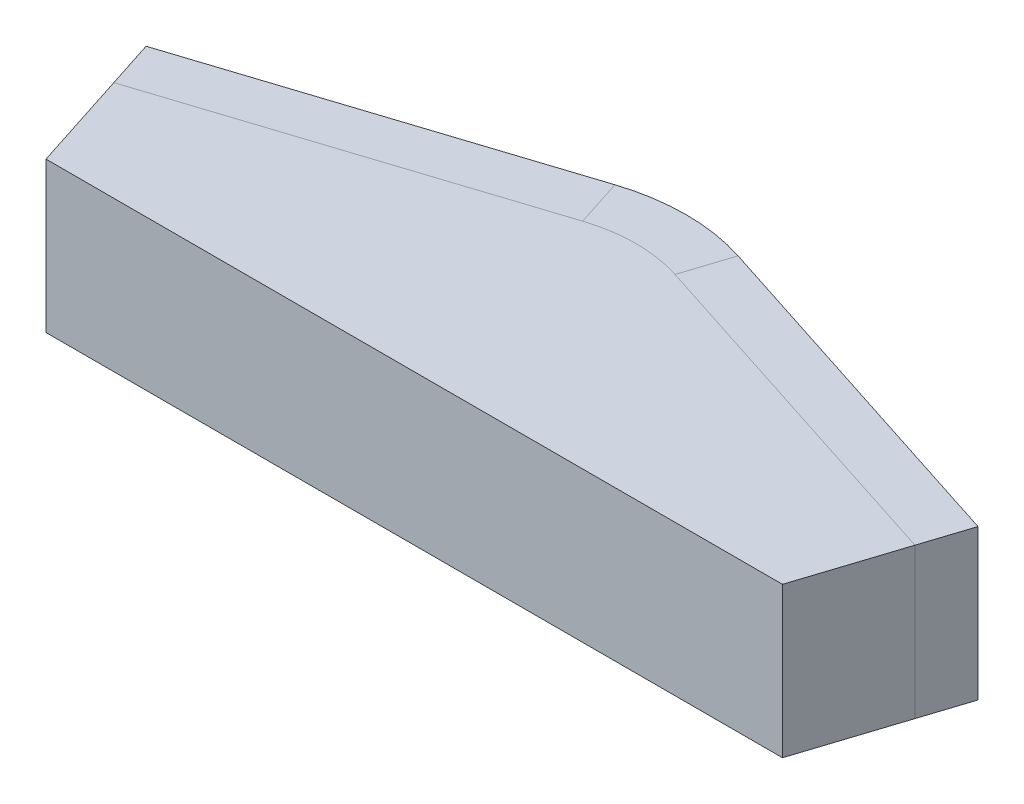
ISO-10303-21;
HEADER;
FILE_DESCRIPTION(('STEP AP214'),'2;1');
FILE_NAME('part.step','',(''),(''),'','','');
FILE_SCHEMA(('AUTOMOTIVE_DESIGN { 1 0 10303 214 1 1 1 1 }'));
ENDSEC;
DATA;
#1=APPLICATION_CONTEXT('core data for automotive mechanical design processes');
#2=APPLICATION_PROTOCOL_DEFINITION('international standard','automotive_design',2000,#1);
#3=PRODUCT_CONTEXT('',#1,'mechanical');
#4=PRODUCT('Part','Part','',(#3));
#5=PRODUCT_RELATED_PRODUCT_CATEGORY('part','',(#4));
#6=PRODUCT_DEFINITION_FORMATION('','',#4);
#7=PRODUCT_DEFINITION_CONTEXT('part definition',#1,'design');
#8=PRODUCT_DEFINITION('design','',#6,#7);
#9=PRODUCT_DEFINITION_SHAPE('','',#8);
#10=(LENGTH_UNIT() NAMED_UNIT(*) SI_UNIT(.MILLI.,.METRE.));
#11=(NAMED_UNIT(*) PLANE_ANGLE_UNIT() SI_UNIT($,.RADIAN.));
#12=(NAMED_UNIT(*) SI_UNIT($,.STERADIAN.) SOLID_ANGLE_UNIT());
#13=UNCERTAINTY_MEASURE_WITH_UNIT(LENGTH_MEASURE(1.E-05),#10,'distance_accuracy_value','');
#14=(GEOMETRIC_REPRESENTATION_CONTEXT(3) GLOBAL_UNCERTAINTY_ASSIGNED_CONTEXT((#13)) GLOBAL_UNIT_ASSIGNED_CONTEXT((#10,
#11,#12)) REPRESENTATION_CONTEXT('',''));
#15=CARTESIAN_POINT('',(0.,0.,0.));
#16=DIRECTION('',(0.,0.,1.));
#17=DIRECTION('',(1.,0.,0.));
#18=AXIS2_PLACEMENT_3D('',#15,#16,#17);
#19=CARTESIAN_POINT('',(25.4,-4.7625,8.20397646338431));
#20=DIRECTION('',(0.,1.,0.));
#21=DIRECTION('',(0.951594403879438,0.,0.307356617799808));
#22=AXIS2_PLACEMENT_3D('',#19,#20,#21);
#23=PLANE('',#22);
#24=DIRECTION('',(-0.307356617799808,0.,0.951594403879438));
#25=VECTOR('',#24,1.);
#26=CARTESIAN_POINT('',(2.92757178454318,-4.7625,0.945579921860638));
#27=LINE('',#26,#25);
#28=CARTESIAN_POINT('',(3.90342904605757,-4.7625,-2.07573231045658));
#29=VERTEX_POINT('',#28);
#30=CARTESIAN_POINT('',(2.92757178454318,-4.7625,0.945579921860638));
#31=VERTEX_POINT('',#30);
#32=EDGE_CURVE('E12',#29,#31,#27,.T.);
#33=ORIENTED_EDGE('',*,*,#32,.F.);
#34=DIRECTION('',(-0.951594403879438,0.,-0.307356617799808));
#35=VECTOR('',#34,1.);
#36=CARTESIAN_POINT('',(26.3758572615144,-4.7625,5.18266423106709));
#37=LINE('',#36,#35);
#38=CARTESIAN_POINT('',(26.3758572615144,-4.7625,5.18266423106709));
#39=VERTEX_POINT('',#38);
#40=EDGE_CURVE('E101',#29,#39,#37,.F.);
#41=ORIENTED_EDGE('',*,*,#40,.T.);
#42=DIRECTION('',(-0.307356617799808,0.,0.951594403879438));
#43=VECTOR('',#42,1.);
#44=CARTESIAN_POINT('',(25.4,-4.7625,8.20397646338431));
#45=LINE('',#44,#43);
#46=CARTESIAN_POINT('',(25.4,-4.7625,8.20397646338431));
#47=VERTEX_POINT('',#46);
#48=EDGE_CURVE('E61',#39,#47,#45,.T.);
#49=ORIENTED_EDGE('',*,*,#48,.T.);
#50=DIRECTION('',(0.951594403879438,0.,0.307356617799808));
#51=VECTOR('',#50,1.);
#52=CARTESIAN_POINT('',(25.4,-4.7625,8.20397646338431));
#53=LINE('',#52,#51);
#54=EDGE_CURVE('E104',#31,#47,#53,.T.);
#55=ORIENTED_EDGE('',*,*,#54,.F.);
#56=EDGE_LOOP('',(#33,#41,#49,#55));
#57=FACE_BOUND('',#56,.T.);
#58=ADVANCED_FACE('F51',(#57),#23,.F.);
#59=CARTESIAN_POINT('',(25.4,4.7625,8.20397646338431));
#60=DIRECTION('',(0.951594403879438,0.,0.307356617799808));
#61=DIRECTION('',(0.,-1.,0.));
#62=AXIS2_PLACEMENT_3D('',#59,#60,#61);
#63=PLANE('',#62);
#64=ORIENTED_EDGE('',*,*,#48,.F.);
#65=DIRECTION('',(0.,1.,0.));
#66=VECTOR('',#65,1.);
#67=CARTESIAN_POINT('',(26.3758572615144,4.7625,5.18266423106709));
#68=LINE('',#67,#66);
#69=CARTESIAN_POINT('',(26.3758572615144,4.7625,5.18266423106709));
#70=VERTEX_POINT('',#69);
#71=EDGE_CURVE('E129',#70,#39,#68,.F.);
#72=ORIENTED_EDGE('',*,*,#71,.F.);
#73=DIRECTION('',(-0.307356617799808,0.,0.951594403879438));
#74=VECTOR('',#73,1.);
#75=CARTESIAN_POINT('',(25.4,4.7625,8.20397646338431));
#76=LINE('',#75,#74);
#77=CARTESIAN_POINT('',(25.4,4.7625,8.20397646338431));
#78=VERTEX_POINT('',#77);
#79=EDGE_CURVE('E147',#70,#78,#76,.T.);
#80=ORIENTED_EDGE('',*,*,#79,.T.);
#81=DIRECTION('',(0.,-1.,0.));
#82=VECTOR('',#81,1.);
#83=CARTESIAN_POINT('',(25.4,4.7625,8.20397646338431));
#84=LINE('',#83,#82);
#85=EDGE_CURVE('E158',#78,#47,#84,.T.);
#86=ORIENTED_EDGE('',*,*,#85,.T.);
#87=EDGE_LOOP('',(#64,#72,#80,#86));
#88=FACE_BOUND('',#87,.T.);
#89=ADVANCED_FACE('F164',(#88),#63,.T.);
#90=CARTESIAN_POINT('',(25.4,4.7625,8.20397646338431));
#91=DIRECTION('',(0.,1.,0.));
#92=DIRECTION('',(0.951594403879438,0.,0.307356617799808));
#93=AXIS2_PLACEMENT_3D('',#90,#91,#92);
#94=PLANE('',#93);
#95=ORIENTED_EDGE('',*,*,#79,.F.);
#96=DIRECTION('',(-0.951594403879438,0.,-0.307356617799808));
#97=VECTOR('',#96,1.);
#98=CARTESIAN_POINT('',(26.3758572615144,4.7625,5.18266423106709));
#99=LINE('',#98,#97);
#100=CARTESIAN_POINT('',(3.90342904605757,4.7625,-2.07573231045658));
#101=VERTEX_POINT('',#100);
#102=EDGE_CURVE('E189',#101,#70,#99,.F.);
#103=ORIENTED_EDGE('',*,*,#102,.F.);
#104=DIRECTION('',(-0.307356617799809,0.,0.951594403879438));
#105=VECTOR('',#104,1.);
#106=CARTESIAN_POINT('',(2.92757178454318,4.7625,0.945579921860638));
#107=LINE('',#106,#105);
#108=CARTESIAN_POINT('',(2.92757178454318,4.7625,0.945579921860638));
#109=VERTEX_POINT('',#108);
#110=EDGE_CURVE('E144',#101,#109,#107,.T.);
#111=ORIENTED_EDGE('',*,*,#110,.T.);
#112=DIRECTION('',(0.951594403879438,0.,0.307356617799808));
#113=VECTOR('',#112,1.);
#114=CARTESIAN_POINT('',(25.4,4.7625,8.20397646338431));
#115=LINE('',#114,#113);
#116=EDGE_CURVE('E165',#109,#78,#115,.T.);
#117=ORIENTED_EDGE('',*,*,#116,.T.);
#118=EDGE_LOOP('',(#95,#103,#111,#117));
#119=FACE_BOUND('',#118,.T.);
#120=ADVANCED_FACE('F195',(#119),#94,.T.);
#121=CARTESIAN_POINT('',(0.,4.7625,10.0095166188123));
#122=DIRECTION('',(0.,1.,0.));
#123=DIRECTION('',(0.,0.,1.));
#124=AXIS2_PLACEMENT_3D('',#121,#122,#123);
#125=PLANE('',#124);
#126=ORIENTED_EDGE('',*,*,#110,.F.);
#127=CARTESIAN_POINT('',(0.,4.7625,10.0095166188123));
#128=DIRECTION('',(0.,1.,0.));
#129=DIRECTION('',(0.,0.,1.));
#130=AXIS2_PLACEMENT_3D('',#127,#128,#129);
#131=CIRCLE('',#130,12.7);
#132=CARTESIAN_POINT('',(-3.90342904605756,4.7625,-2.07573231045658));
#133=VERTEX_POINT('',#132);
#134=EDGE_CURVE('E119',#101,#133,#131,.T.);
#135=ORIENTED_EDGE('',*,*,#134,.T.);
#136=DIRECTION('',(0.307356617799808,0.,0.951594403879438));
#137=VECTOR('',#136,1.);
#138=CARTESIAN_POINT('',(-2.92757178454318,4.7625,0.945579921860638));
#139=LINE('',#138,#137);
#140=CARTESIAN_POINT('',(-2.92757178454318,4.7625,0.945579921860638));
#141=VERTEX_POINT('',#140);
#142=EDGE_CURVE('E69',#133,#141,#139,.T.);
#143=ORIENTED_EDGE('',*,*,#142,.T.);
#144=CARTESIAN_POINT('',(0.,4.7625,10.0095166188123));
#145=DIRECTION('',(0.,-1.,0.));
#146=DIRECTION('',(0.,0.,-1.));
#147=AXIS2_PLACEMENT_3D('',#144,#145,#146);
#148=CIRCLE('',#147,9.525);
#149=EDGE_CURVE('E162',#109,#141,#148,.F.);
#150=ORIENTED_EDGE('',*,*,#149,.F.);
#151=EDGE_LOOP('',(#126,#135,#143,#150));
#152=FACE_BOUND('',#151,.T.);
#153=ADVANCED_FACE('F198',(#152),#125,.T.);
#154=CARTESIAN_POINT('',(0.,4.7625,0.));
#155=DIRECTION('',(0.,1.,0.));
#156=DIRECTION('',(0.951594403879438,0.,-0.307356617799808));
#157=AXIS2_PLACEMENT_3D('',#154,#155,#156);
#158=PLANE('',#157);
#159=ORIENTED_EDGE('',*,*,#142,.F.);
#160=DIRECTION('',(-0.951594403879438,0.,0.307356617799808));
#161=VECTOR('',#160,1.);
#162=CARTESIAN_POINT('',(-0.975857261514391,4.7625,-3.02131223231722));
#163=LINE('',#162,#161);
#164=CARTESIAN_POINT('',(-26.3758572615144,4.7625,5.18266423106709));
#165=VERTEX_POINT('',#164);
#166=EDGE_CURVE('E188',#165,#133,#163,.F.);
#167=ORIENTED_EDGE('',*,*,#166,.F.);
#168=DIRECTION('',(0.307356617799808,0.,0.951594403879438));
#169=VECTOR('',#168,1.);
#170=CARTESIAN_POINT('',(-25.4,4.7625,8.20397646338431));
#171=LINE('',#170,#169);
#172=CARTESIAN_POINT('',(-25.4,4.7625,8.20397646338431));
#173=VERTEX_POINT('',#172);
#174=EDGE_CURVE('E140',#165,#173,#171,.T.);
#175=ORIENTED_EDGE('',*,*,#174,.T.);
#176=DIRECTION('',(0.951594403879438,0.,-0.307356617799808));
#177=VECTOR('',#176,1.);
#178=CARTESIAN_POINT('',(0.,4.7625,0.));
#179=LINE('',#178,#177);
#180=EDGE_CURVE('E172',#173,#141,#179,.T.);
#181=ORIENTED_EDGE('',*,*,#180,.T.);
#182=EDGE_LOOP('',(#159,#167,#175,#181));
#183=FACE_BOUND('',#182,.T.);
#184=ADVANCED_FACE('F209',(#183),#158,.T.);
#185=CARTESIAN_POINT('',(-25.4,4.7625,8.20397646338431));
#186=DIRECTION('',(0.951594403879438,0.,-0.307356617799808));
#187=DIRECTION('',(0.,-1.,0.));
#188=AXIS2_PLACEMENT_3D('',#185,#186,#187);
#189=PLANE('',#188);
#190=ORIENTED_EDGE('',*,*,#174,.F.);
#191=DIRECTION('',(0.,1.,0.));
#192=VECTOR('',#191,1.);
#193=CARTESIAN_POINT('',(-26.3758572615144,4.7625,5.18266423106709));
#194=LINE('',#193,#192);
#195=CARTESIAN_POINT('',(-26.3758572615144,-4.7625,5.18266423106709));
#196=VERTEX_POINT('',#195);
#197=EDGE_CURVE('E124',#165,#196,#194,.F.);
#198=ORIENTED_EDGE('',*,*,#197,.T.);
#199=DIRECTION('',(0.307356617799808,0.,0.951594403879438));
#200=VECTOR('',#199,1.);
#201=CARTESIAN_POINT('',(-25.4,-4.7625,8.20397646338431));
#202=LINE('',#201,#200);
#203=CARTESIAN_POINT('',(-25.4,-4.7625,8.20397646338431));
#204=VERTEX_POINT('',#203);
#205=EDGE_CURVE('E137',#196,#204,#202,.T.);
#206=ORIENTED_EDGE('',*,*,#205,.T.);
#207=DIRECTION('',(0.,-1.,0.));
#208=VECTOR('',#207,1.);
#209=CARTESIAN_POINT('',(-25.4,4.7625,8.20397646338431));
#210=LINE('',#209,#208);
#211=EDGE_CURVE('E175',#173,#204,#210,.T.);
#212=ORIENTED_EDGE('',*,*,#211,.F.);
#213=EDGE_LOOP('',(#190,#198,#206,#212));
#214=FACE_BOUND('',#213,.T.);
#215=ADVANCED_FACE('F215',(#214),#189,.F.);
#216=CARTESIAN_POINT('',(0.,-4.7625,0.));
#217=DIRECTION('',(0.,1.,0.));
#218=DIRECTION('',(0.951594403879438,0.,-0.307356617799808));
#219=AXIS2_PLACEMENT_3D('',#216,#217,#218);
#220=PLANE('',#219);
#221=ORIENTED_EDGE('',*,*,#205,.F.);
#222=DIRECTION('',(-0.951594403879438,0.,0.307356617799808));
#223=VECTOR('',#222,1.);
#224=CARTESIAN_POINT('',(-0.975857261514391,-4.7625,-3.02131223231722));
#225=LINE('',#224,#223);
#226=CARTESIAN_POINT('',(-3.90342904605757,-4.7625,-2.07573231045658));
#227=VERTEX_POINT('',#226);
#228=EDGE_CURVE('E186',#196,#227,#225,.F.);
#229=ORIENTED_EDGE('',*,*,#228,.T.);
#230=DIRECTION('',(0.307356617799808,0.,0.951594403879438));
#231=VECTOR('',#230,1.);
#232=CARTESIAN_POINT('',(-2.92757178454318,-4.7625,0.945579921860638));
#233=LINE('',#232,#231);
#234=CARTESIAN_POINT('',(-2.92757178454318,-4.7625,0.945579921860638));
#235=VERTEX_POINT('',#234);
#236=EDGE_CURVE('E55',#227,#235,#233,.T.);
#237=ORIENTED_EDGE('',*,*,#236,.T.);
#238=DIRECTION('',(0.951594403879438,0.,-0.307356617799808));
#239=VECTOR('',#238,1.);
#240=CARTESIAN_POINT('',(0.,-4.7625,0.));
#241=LINE('',#240,#239);
#242=EDGE_CURVE('E167',#204,#235,#241,.T.);
#243=ORIENTED_EDGE('',*,*,#242,.F.);
#244=EDGE_LOOP('',(#221,#229,#237,#243));
#245=FACE_BOUND('',#244,.T.);
#246=ADVANCED_FACE('F219',(#245),#220,.F.);
#247=CARTESIAN_POINT('',(0.,-4.7625,10.0095166188123));
#248=DIRECTION('',(0.,-1.,0.));
#249=DIRECTION('',(0.,0.,-1.));
#250=AXIS2_PLACEMENT_3D('',#247,#248,#249);
#251=PLANE('',#250);
#252=CARTESIAN_POINT('',(0.,-4.7625,10.0095166188123));
#253=DIRECTION('',(0.,1.,0.));
#254=DIRECTION('',(0.,0.,1.));
#255=AXIS2_PLACEMENT_3D('',#252,#253,#254);
#256=CIRCLE('',#255,12.7);
#257=EDGE_CURVE('E117',#227,#29,#256,.F.);
#258=ORIENTED_EDGE('',*,*,#257,.T.);
#259=ORIENTED_EDGE('',*,*,#32,.T.);
#260=CARTESIAN_POINT('',(0.,-4.7625,10.0095166188123));
#261=DIRECTION('',(0.,1.,0.));
#262=DIRECTION('',(0.,0.,1.));
#263=AXIS2_PLACEMENT_3D('',#260,#261,#262);
#264=CIRCLE('',#263,9.525);
#265=EDGE_CURVE('E182',#235,#31,#264,.F.);
#266=ORIENTED_EDGE('',*,*,#265,.F.);
#267=ORIENTED_EDGE('',*,*,#236,.F.);
#268=EDGE_LOOP('',(#258,#259,#266,#267));
#269=FACE_BOUND('',#268,.T.);
#270=ADVANCED_FACE('F53',(#269),#251,.T.);
#271=CARTESIAN_POINT('',(0.,4.7625,0.));
#272=DIRECTION('',(-0.307356617799808,0.,-0.951594403879438));
#273=DIRECTION('',(-0.951594403879438,0.,0.307356617799808));
#274=AXIS2_PLACEMENT_3D('',#271,#272,#273);
#275=PLANE('',#274);
#276=ORIENTED_EDGE('',*,*,#242,.T.);
#277=DIRECTION('',(0.,-1.,0.));
#278=VECTOR('',#277,1.);
#279=CARTESIAN_POINT('',(-2.92757178454318,4.7625,0.945579921860635));
#280=LINE('',#279,#278);
#281=EDGE_CURVE('E179',#235,#141,#280,.F.);
#282=ORIENTED_EDGE('',*,*,#281,.T.);
#283=ORIENTED_EDGE('',*,*,#180,.F.);
#284=ORIENTED_EDGE('',*,*,#211,.T.);
#285=EDGE_LOOP('',(#276,#282,#283,#284));
#286=FACE_BOUND('',#285,.T.);
#287=ADVANCED_FACE('F214',(#286),#275,.F.);
#288=CARTESIAN_POINT('',(25.4,4.7625,8.20397646338431));
#289=DIRECTION('',(0.307356617799808,0.,-0.951594403879438));
#290=DIRECTION('',(-0.951594403879438,0.,-0.307356617799808));
#291=AXIS2_PLACEMENT_3D('',#288,#289,#290);
#292=PLANE('',#291);
#293=ORIENTED_EDGE('',*,*,#116,.F.);
#294=DIRECTION('',(0.,-1.,0.));
#295=VECTOR('',#294,1.);
#296=CARTESIAN_POINT('',(2.92757178454317,-4.7625,0.945579921860633));
#297=LINE('',#296,#295);
#298=EDGE_CURVE('E161',#109,#31,#297,.T.);
#299=ORIENTED_EDGE('',*,*,#298,.T.);
#300=ORIENTED_EDGE('',*,*,#54,.T.);
#301=ORIENTED_EDGE('',*,*,#85,.F.);
#302=EDGE_LOOP('',(#293,#299,#300,#301));
#303=FACE_BOUND('',#302,.T.);
#304=ADVANCED_FACE('F157',(#303),#292,.F.);
#305=CARTESIAN_POINT('',(0.,4.7625,10.0095166188123));
#306=DIRECTION('',(0.,1.,0.));
#307=DIRECTION('',(0.,0.,1.));
#308=AXIS2_PLACEMENT_3D('',#305,#306,#307);
#309=CYLINDRICAL_SURFACE('',#308,9.525);
#310=ORIENTED_EDGE('',*,*,#149,.T.);
#311=ORIENTED_EDGE('',*,*,#281,.F.);
#312=ORIENTED_EDGE('',*,*,#265,.T.);
#313=ORIENTED_EDGE('',*,*,#298,.F.);
#314=EDGE_LOOP('',(#310,#311,#312,#313));
#315=FACE_BOUND('',#314,.T.);
#316=ADVANCED_FACE('F201',(#315),#309,.F.);
#317=CARTESIAN_POINT('',(-0.975857261514391,4.7625,-3.02131223231722));
#318=DIRECTION('',(-0.307356617799808,0.,-0.951594403879438));
#319=DIRECTION('',(-0.951594403879438,0.,0.307356617799808));
#320=AXIS2_PLACEMENT_3D('',#317,#318,#319);
#321=PLANE('',#320);
#322=ORIENTED_EDGE('',*,*,#228,.F.);
#323=ORIENTED_EDGE('',*,*,#197,.F.);
#324=ORIENTED_EDGE('',*,*,#166,.T.);
#325=DIRECTION('',(0.,1.,0.));
#326=VECTOR('',#325,1.);
#327=CARTESIAN_POINT('',(-3.90342904605757,4.7625,-2.07573231045658));
#328=LINE('',#327,#326);
#329=EDGE_CURVE('E123',#227,#133,#328,.T.);
#330=ORIENTED_EDGE('',*,*,#329,.F.);
#331=EDGE_LOOP('',(#322,#323,#324,#330));
#332=FACE_BOUND('',#331,.T.);
#333=ADVANCED_FACE('F221',(#332),#321,.T.);
#334=CARTESIAN_POINT('',(26.3758572615144,4.7625,5.18266423106709));
#335=DIRECTION('',(0.307356617799808,0.,-0.951594403879438));
#336=DIRECTION('',(-0.951594403879438,0.,-0.307356617799808));
#337=AXIS2_PLACEMENT_3D('',#334,#335,#336);
#338=PLANE('',#337);
#339=ORIENTED_EDGE('',*,*,#102,.T.);
#340=ORIENTED_EDGE('',*,*,#71,.T.);
#341=ORIENTED_EDGE('',*,*,#40,.F.);
#342=DIRECTION('',(0.,1.,0.));
#343=VECTOR('',#342,1.);
#344=CARTESIAN_POINT('',(3.90342904605757,4.7625,-2.07573231045658));
#345=LINE('',#344,#343);
#346=EDGE_CURVE('E114',#101,#29,#345,.F.);
#347=ORIENTED_EDGE('',*,*,#346,.F.);
#348=EDGE_LOOP('',(#339,#340,#341,#347));
#349=FACE_BOUND('',#348,.T.);
#350=ADVANCED_FACE('F127',(#349),#338,.T.);
#351=CARTESIAN_POINT('',(0.,4.7625,10.0095166188123));
#352=DIRECTION('',(0.,1.,0.));
#353=DIRECTION('',(0.,0.,1.));
#354=AXIS2_PLACEMENT_3D('',#351,#352,#353);
#355=CYLINDRICAL_SURFACE('',#354,12.7);
#356=ORIENTED_EDGE('',*,*,#134,.F.);
#357=ORIENTED_EDGE('',*,*,#346,.T.);
#358=ORIENTED_EDGE('',*,*,#257,.F.);
#359=ORIENTED_EDGE('',*,*,#329,.T.);
#360=EDGE_LOOP('',(#356,#357,#358,#359));
#361=FACE_BOUND('',#360,.T.);
#362=ADVANCED_FACE('F115',(#361),#355,.T.);
#363=CLOSED_SHELL('',(#58,#89,#120,#153,#184,#215,#246,#270,#287,#304,#316,#333,#350,#362));
#364=MANIFOLD_SOLID_BREP('B2',#363);
#365=CARTESIAN_POINT('',(0.,-4.7625,0.));
#366=DIRECTION('',(0.,-1.,0.));
#367=DIRECTION('',(0.,0.,-1.));
#368=AXIS2_PLACEMENT_3D('',#365,#366,#367);
#369=PLANE('',#368);
#370=DIRECTION('',(0.307356617799808,0.,0.951594403879438));
#371=VECTOR('',#370,1.);
#372=CARTESIAN_POINT('',(-23.3490058841539,-4.7625,14.5539764633843));
#373=LINE('',#372,#371);
#374=CARTESIAN_POINT('',(-25.4,-4.7625,8.20397646338431));
#375=VERTEX_POINT('',#374);
#376=CARTESIAN_POINT('',(-23.3490058841539,-4.7625,14.5539764633843));
#377=VERTEX_POINT('',#376);
#378=EDGE_CURVE('E389',#375,#377,#373,.T.);
#379=ORIENTED_EDGE('',*,*,#378,.F.);
#380=DIRECTION('',(-0.951594403879438,0.,0.307356617799808));
#381=VECTOR('',#380,1.);
#382=CARTESIAN_POINT('',(-25.4,-4.7625,8.20397646338431));
#383=LINE('',#382,#381);
#384=CARTESIAN_POINT('',(-2.92757178454321,-4.7625,0.945579921860649));
#385=VERTEX_POINT('',#384);
#386=EDGE_CURVE('E463',#385,#375,#383,.T.);
#387=ORIENTED_EDGE('',*,*,#386,.F.);
#388=CARTESIAN_POINT('',(0.,-4.7625,10.0095166188123));
#389=DIRECTION('',(0.,-1.,0.));
#390=DIRECTION('',(0.,0.,-1.));
#391=AXIS2_PLACEMENT_3D('',#388,#389,#390);
#392=CIRCLE('',#391,9.525);
#393=CARTESIAN_POINT('',(2.92757178454321,-4.7625,0.945579921860649));
#394=VERTEX_POINT('',#393);
#395=EDGE_CURVE('E467',#394,#385,#392,.F.);
#396=ORIENTED_EDGE('',*,*,#395,.F.);
#397=DIRECTION('',(-0.951594403879438,0.,-0.307356617799808));
#398=VECTOR('',#397,1.);
#399=CARTESIAN_POINT('',(2.92757178454321,-4.7625,0.945579921860649));
#400=LINE('',#399,#398);
#401=CARTESIAN_POINT('',(25.4,-4.7625,8.20397646338431));
#402=VERTEX_POINT('',#401);
#403=EDGE_CURVE('E418',#402,#394,#400,.T.);
#404=ORIENTED_EDGE('',*,*,#403,.F.);
#405=DIRECTION('',(0.307356617799808,0.,-0.951594403879438));
#406=VECTOR('',#405,1.);
#407=CARTESIAN_POINT('',(25.4,-4.7625,8.20397646338431));
#408=LINE('',#407,#406);
#409=CARTESIAN_POINT('',(23.3490058841539,-4.76250000000002,14.5539764633843));
#410=VERTEX_POINT('',#409);
#411=EDGE_CURVE('E423',#410,#402,#408,.T.);
#412=ORIENTED_EDGE('',*,*,#411,.F.);
#413=DIRECTION('',(1.,0.,0.));
#414=VECTOR('',#413,1.);
#415=CARTESIAN_POINT('',(23.3490058841539,-4.7625,14.5539764633843));
#416=LINE('',#415,#414);
#417=EDGE_CURVE('E444',#377,#410,#416,.T.);
#418=ORIENTED_EDGE('',*,*,#417,.F.);
#419=EDGE_LOOP('',(#379,#387,#396,#404,#412,#418));
#420=FACE_BOUND('',#419,.T.);
#421=ADVANCED_FACE('F381',(#420),#369,.T.);
#422=CARTESIAN_POINT('',(0.,4.7625,10.0095166188123));
#423=DIRECTION('',(0.,1.,0.));
#424=DIRECTION('',(0.,0.,1.));
#425=AXIS2_PLACEMENT_3D('',#422,#423,#424);
#426=PLANE('',#425);
#427=DIRECTION('',(0.307356617799808,0.,0.951594403879438));
#428=VECTOR('',#427,1.);
#429=CARTESIAN_POINT('',(-23.3490058841539,4.7625,14.5539764633843));
#430=LINE('',#429,#428);
#431=CARTESIAN_POINT('',(-25.4,4.7625,8.20397646338431));
#432=VERTEX_POINT('',#431);
#433=CARTESIAN_POINT('',(-23.3490058841539,4.7625,14.5539764633843));
#434=VERTEX_POINT('',#433);
#435=EDGE_CURVE('E454',#432,#434,#430,.T.);
#436=ORIENTED_EDGE('',*,*,#435,.T.);
#437=DIRECTION('',(1.,0.,0.));
#438=VECTOR('',#437,1.);
#439=CARTESIAN_POINT('',(23.3490058841539,4.7625,14.5539764633843));
#440=LINE('',#439,#438);
#441=CARTESIAN_POINT('',(23.3490058841539,4.7625,14.5539764633843));
#442=VERTEX_POINT('',#441);
#443=EDGE_CURVE('E442',#434,#442,#440,.T.);
#444=ORIENTED_EDGE('',*,*,#443,.T.);
#445=DIRECTION('',(0.307356617799808,0.,-0.951594403879438));
#446=VECTOR('',#445,1.);
#447=CARTESIAN_POINT('',(25.4,4.7625,8.20397646338431));
#448=LINE('',#447,#446);
#449=CARTESIAN_POINT('',(25.4,4.7625,8.20397646338431));
#450=VERTEX_POINT('',#449);
#451=EDGE_CURVE('E446',#442,#450,#448,.T.);
#452=ORIENTED_EDGE('',*,*,#451,.T.);
#453=DIRECTION('',(-0.951594403879438,0.,-0.307356617799808));
#454=VECTOR('',#453,1.);
#455=CARTESIAN_POINT('',(2.92757178454321,4.7625,0.945579921860649));
#456=LINE('',#455,#454);
#457=CARTESIAN_POINT('',(2.92757178454321,4.7625,0.945579921860651));
#458=VERTEX_POINT('',#457);
#459=EDGE_CURVE('E450',#450,#458,#456,.T.);
#460=ORIENTED_EDGE('',*,*,#459,.T.);
#461=CARTESIAN_POINT('',(0.,4.7625,10.0095166188123));
#462=DIRECTION('',(0.,1.,0.));
#463=DIRECTION('',(0.,0.,1.));
#464=AXIS2_PLACEMENT_3D('',#461,#462,#463);
#465=CIRCLE('',#464,9.525);
#466=CARTESIAN_POINT('',(-2.92757178454321,4.7625,0.945579921860649));
#467=VERTEX_POINT('',#466);
#468=EDGE_CURVE('E482',#458,#467,#465,.T.);
#469=ORIENTED_EDGE('',*,*,#468,.T.);
#470=DIRECTION('',(-0.951594403879438,0.,0.307356617799808));
#471=VECTOR('',#470,1.);
#472=CARTESIAN_POINT('',(-25.4,4.7625,8.20397646338431));
#473=LINE('',#472,#471);
#474=EDGE_CURVE('E460',#467,#432,#473,.T.);
#475=ORIENTED_EDGE('',*,*,#474,.T.);
#476=EDGE_LOOP('',(#436,#444,#452,#460,#469,#475));
#477=FACE_BOUND('',#476,.T.);
#478=ADVANCED_FACE('F452',(#477),#426,.T.);
#479=CARTESIAN_POINT('',(23.3490058841539,-57.4748296802373,14.5539764633843));
#480=DIRECTION('',(0.,0.,1.));
#481=DIRECTION('',(1.,0.,0.));
#482=AXIS2_PLACEMENT_3D('',#479,#480,#481);
#483=PLANE('',#482);
#484=DIRECTION('',(0.,1.,0.));
#485=VECTOR('',#484,1.);
#486=CARTESIAN_POINT('',(-23.3490058841539,-57.4748296802373,14.5539764633843));
#487=LINE('',#486,#485);
#488=EDGE_CURVE('E49',#377,#434,#487,.T.);
#489=ORIENTED_EDGE('',*,*,#488,.F.);
#490=ORIENTED_EDGE('',*,*,#417,.T.);
#491=DIRECTION('',(0.,1.,0.));
#492=VECTOR('',#491,1.);
#493=CARTESIAN_POINT('',(23.3490058841539,-57.4748296802373,14.5539764633843));
#494=LINE('',#493,#492);
#495=EDGE_CURVE('E439',#410,#442,#494,.T.);
#496=ORIENTED_EDGE('',*,*,#495,.T.);
#497=ORIENTED_EDGE('',*,*,#443,.F.);
#498=EDGE_LOOP('',(#489,#490,#496,#497));
#499=FACE_BOUND('',#498,.T.);
#500=ADVANCED_FACE('F440',(#499),#483,.T.);
#501=CARTESIAN_POINT('',(25.4,-57.4748296802373,8.20397646338431));
#502=DIRECTION('',(0.951594403879438,0.,0.307356617799808));
#503=DIRECTION('',(0.307356617799808,0.,-0.951594403879438));
#504=AXIS2_PLACEMENT_3D('',#501,#502,#503);
#505=PLANE('',#504);
#506=ORIENTED_EDGE('',*,*,#495,.F.);
#507=ORIENTED_EDGE('',*,*,#411,.T.);
#508=DIRECTION('',(0.,1.,0.));
#509=VECTOR('',#508,1.);
#510=CARTESIAN_POINT('',(25.4,-57.4748296802373,8.20397646338431));
#511=LINE('',#510,#509);
#512=EDGE_CURVE('E434',#402,#450,#511,.T.);
#513=ORIENTED_EDGE('',*,*,#512,.T.);
#514=ORIENTED_EDGE('',*,*,#451,.F.);
#515=EDGE_LOOP('',(#506,#507,#513,#514));
#516=FACE_BOUND('',#515,.T.);
#517=ADVANCED_FACE('F447',(#516),#505,.T.);
#518=CARTESIAN_POINT('',(2.92757178454321,-57.4748296802373,0.945579921860649));
#519=DIRECTION('',(0.307356617799808,0.,-0.951594403879438));
#520=DIRECTION('',(-0.951594403879438,0.,-0.307356617799808));
#521=AXIS2_PLACEMENT_3D('',#518,#519,#520);
#522=PLANE('',#521);
#523=ORIENTED_EDGE('',*,*,#512,.F.);
#524=ORIENTED_EDGE('',*,*,#403,.T.);
#525=DIRECTION('',(0.,1.,0.));
#526=VECTOR('',#525,1.);
#527=CARTESIAN_POINT('',(2.92757178454321,-57.4748296802373,0.945579921860651));
#528=LINE('',#527,#526);
#529=EDGE_CURVE('E470',#394,#458,#528,.T.);
#530=ORIENTED_EDGE('',*,*,#529,.T.);
#531=ORIENTED_EDGE('',*,*,#459,.F.);
#532=EDGE_LOOP('',(#523,#524,#530,#531));
#533=FACE_BOUND('',#532,.T.);
#534=ADVANCED_FACE('F479',(#533),#522,.T.);
#535=CARTESIAN_POINT('',(0.,-57.4748296802373,10.0095166188123));
#536=DIRECTION('',(0.,1.,0.));
#537=DIRECTION('',(0.,0.,1.));
#538=AXIS2_PLACEMENT_3D('',#535,#536,#537);
#539=CYLINDRICAL_SURFACE('',#538,9.525);
#540=ORIENTED_EDGE('',*,*,#529,.F.);
#541=ORIENTED_EDGE('',*,*,#395,.T.);
#542=DIRECTION('',(0.,1.,0.));
#543=VECTOR('',#542,1.);
#544=CARTESIAN_POINT('',(-2.92757178454321,-57.4748296802373,0.945579921860649));
#545=LINE('',#544,#543);
#546=EDGE_CURVE('E466',#385,#467,#545,.T.);
#547=ORIENTED_EDGE('',*,*,#546,.T.);
#548=ORIENTED_EDGE('',*,*,#468,.F.);
#549=EDGE_LOOP('',(#540,#541,#547,#548));
#550=FACE_BOUND('',#549,.T.);
#551=ADVANCED_FACE('F483',(#550),#539,.T.);
#552=CARTESIAN_POINT('',(-25.4,-57.4748296802373,8.20397646338431));
#553=DIRECTION('',(-0.307356617799808,0.,-0.951594403879438));
#554=DIRECTION('',(-0.951594403879438,0.,0.307356617799808));
#555=AXIS2_PLACEMENT_3D('',#552,#553,#554);
#556=PLANE('',#555);
#557=ORIENTED_EDGE('',*,*,#546,.F.);
#558=ORIENTED_EDGE('',*,*,#386,.T.);
#559=DIRECTION('',(0.,1.,0.));
#560=VECTOR('',#559,1.);
#561=CARTESIAN_POINT('',(-25.4,-57.4748296802373,8.20397646338431));
#562=LINE('',#561,#560);
#563=EDGE_CURVE('E462',#375,#432,#562,.T.);
#564=ORIENTED_EDGE('',*,*,#563,.T.);
#565=ORIENTED_EDGE('',*,*,#474,.F.);
#566=EDGE_LOOP('',(#557,#558,#564,#565));
#567=FACE_BOUND('',#566,.T.);
#568=ADVANCED_FACE('F489',(#567),#556,.T.);
#569=CARTESIAN_POINT('',(-23.3490058841539,-57.4748296802373,14.5539764633843));
#570=DIRECTION('',(-0.951594403879438,0.,0.307356617799808));
#571=DIRECTION('',(0.307356617799808,0.,0.951594403879438));
#572=AXIS2_PLACEMENT_3D('',#569,#570,#571);
#573=PLANE('',#572);
#574=ORIENTED_EDGE('',*,*,#563,.F.);
#575=ORIENTED_EDGE('',*,*,#378,.T.);
#576=ORIENTED_EDGE('',*,*,#488,.T.);
#577=ORIENTED_EDGE('',*,*,#435,.F.);
#578=EDGE_LOOP('',(#574,#575,#576,#577));
#579=FACE_BOUND('',#578,.T.);
#580=ADVANCED_FACE('F491',(#579),#573,.T.);
#581=CLOSED_SHELL('',(#421,#478,#500,#517,#534,#551,#568,#580));
#582=MANIFOLD_SOLID_BREP('B6',#581);
#583=ADVANCED_BREP_SHAPE_REPRESENTATION('',(#18,#364,#582),#14);
#584=SHAPE_DEFINITION_REPRESENTATION(#9,#583);
ENDSEC;
END-ISO-10303-21;
